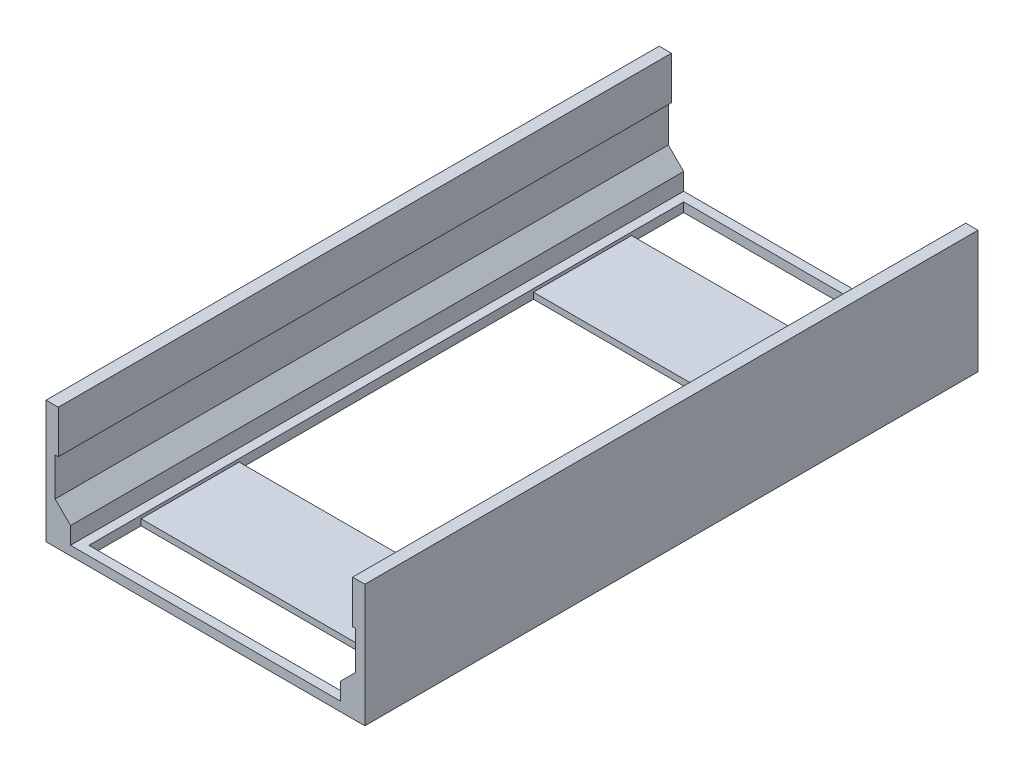
ISO-10303-21;
HEADER;
FILE_DESCRIPTION(('STEP AP214'),'2;1');
FILE_NAME('part.step','',(''),(''),'','','');
FILE_SCHEMA(('AUTOMOTIVE_DESIGN { 1 0 10303 214 1 1 1 1 }'));
ENDSEC;
DATA;
#1=APPLICATION_CONTEXT('core data for automotive mechanical design processes');
#2=APPLICATION_PROTOCOL_DEFINITION('international standard','automotive_design',2000,#1);
#3=PRODUCT_CONTEXT('',#1,'mechanical');
#4=PRODUCT('Part','Part','',(#3));
#5=PRODUCT_RELATED_PRODUCT_CATEGORY('part','',(#4));
#6=PRODUCT_DEFINITION_FORMATION('','',#4);
#7=PRODUCT_DEFINITION_CONTEXT('part definition',#1,'design');
#8=PRODUCT_DEFINITION('design','',#6,#7);
#9=PRODUCT_DEFINITION_SHAPE('','',#8);
#10=(LENGTH_UNIT() NAMED_UNIT(*) SI_UNIT(.MILLI.,.METRE.));
#11=(NAMED_UNIT(*) PLANE_ANGLE_UNIT() SI_UNIT($,.RADIAN.));
#12=(NAMED_UNIT(*) SI_UNIT($,.STERADIAN.) SOLID_ANGLE_UNIT());
#13=UNCERTAINTY_MEASURE_WITH_UNIT(LENGTH_MEASURE(1.E-05),#10,'distance_accuracy_value','');
#14=(GEOMETRIC_REPRESENTATION_CONTEXT(3) GLOBAL_UNCERTAINTY_ASSIGNED_CONTEXT((#13)) GLOBAL_UNIT_ASSIGNED_CONTEXT((#10,
#11,#12)) REPRESENTATION_CONTEXT('',''));
#15=CARTESIAN_POINT('',(0.,0.,0.));
#16=DIRECTION('',(0.,0.,1.));
#17=DIRECTION('',(1.,0.,0.));
#18=AXIS2_PLACEMENT_3D('',#15,#16,#17);
#19=CARTESIAN_POINT('',(-22.,-11.7071067811865,100.00005));
#20=DIRECTION('',(0.707106781186548,0.707106781186548,0.));
#21=DIRECTION('',(-0.707106781186548,0.707106781186548,0.));
#22=AXIS2_PLACEMENT_3D('',#19,#20,#21);
#23=PLANE('',#22);
#24=DIRECTION('',(0.707106781186547,-0.707106781186547,0.));
#25=VECTOR('',#24,1.);
#26=CARTESIAN_POINT('',(-22.,-11.7071067811865,0.));
#27=LINE('',#26,#25);
#28=CARTESIAN_POINT('',(-24.5,-9.20710678118655,0.));
#29=VERTEX_POINT('',#28);
#30=CARTESIAN_POINT('',(-22.,-11.7071067811865,0.));
#31=VERTEX_POINT('',#30);
#32=EDGE_CURVE('E307',#29,#31,#27,.T.);
#33=ORIENTED_EDGE('',*,*,#32,.F.);
#34=DIRECTION('',(0.,0.,-1.));
#35=VECTOR('',#34,1.);
#36=CARTESIAN_POINT('',(-24.5,-9.20710678118655,100.00005));
#37=LINE('',#36,#35);
#38=CARTESIAN_POINT('',(-24.5,-9.20710678118655,100.00005));
#39=VERTEX_POINT('',#38);
#40=EDGE_CURVE('E12',#39,#29,#37,.T.);
#41=ORIENTED_EDGE('',*,*,#40,.F.);
#42=DIRECTION('',(0.707106781186547,-0.707106781186547,0.));
#43=VECTOR('',#42,1.);
#44=CARTESIAN_POINT('',(-22.,-11.7071067811865,100.00005));
#45=LINE('',#44,#43);
#46=CARTESIAN_POINT('',(-22.,-11.7071067811865,100.00005));
#47=VERTEX_POINT('',#46);
#48=EDGE_CURVE('E314',#39,#47,#45,.T.);
#49=ORIENTED_EDGE('',*,*,#48,.T.);
#50=DIRECTION('',(0.,0.,-1.));
#51=VECTOR('',#50,1.);
#52=CARTESIAN_POINT('',(-22.,-11.7071067811865,100.00005));
#53=LINE('',#52,#51);
#54=EDGE_CURVE('E40',#47,#31,#53,.T.);
#55=ORIENTED_EDGE('',*,*,#54,.T.);
#56=EDGE_LOOP('',(#33,#41,#49,#55));
#57=FACE_BOUND('',#56,.T.);
#58=ADVANCED_FACE('F37',(#57),#23,.T.);
#59=CARTESIAN_POINT('',(-24.5,-9.20710678118655,100.00005));
#60=DIRECTION('',(1.,0.,0.));
#61=DIRECTION('',(0.,0.,-1.));
#62=AXIS2_PLACEMENT_3D('',#59,#60,#61);
#63=PLANE('',#62);
#64=DIRECTION('',(0.,-1.,0.));
#65=VECTOR('',#64,1.);
#66=CARTESIAN_POINT('',(-24.5,-9.20710678118655,0.));
#67=LINE('',#66,#65);
#68=CARTESIAN_POINT('',(-24.5,-3.,0.));
#69=VERTEX_POINT('',#68);
#70=EDGE_CURVE('E318',#69,#29,#67,.T.);
#71=ORIENTED_EDGE('',*,*,#70,.F.);
#72=DIRECTION('',(0.,0.,-1.));
#73=VECTOR('',#72,1.);
#74=CARTESIAN_POINT('',(-24.5,-3.,100.00005));
#75=LINE('',#74,#73);
#76=CARTESIAN_POINT('',(-24.5,-3.,100.00005));
#77=VERTEX_POINT('',#76);
#78=EDGE_CURVE('E45',#77,#69,#75,.T.);
#79=ORIENTED_EDGE('',*,*,#78,.F.);
#80=DIRECTION('',(0.,-1.,0.));
#81=VECTOR('',#80,1.);
#82=CARTESIAN_POINT('',(-24.5,-9.20710678118655,100.00005));
#83=LINE('',#82,#81);
#84=EDGE_CURVE('E358',#77,#39,#83,.T.);
#85=ORIENTED_EDGE('',*,*,#84,.T.);
#86=ORIENTED_EDGE('',*,*,#40,.T.);
#87=EDGE_LOOP('',(#71,#79,#85,#86));
#88=FACE_BOUND('',#87,.T.);
#89=ADVANCED_FACE('F447',(#88),#63,.T.);
#90=CARTESIAN_POINT('',(-24.5,-3.,100.00005));
#91=DIRECTION('',(0.,-1.,0.));
#92=DIRECTION('',(0.,0.,-1.));
#93=AXIS2_PLACEMENT_3D('',#90,#91,#92);
#94=PLANE('',#93);
#95=DIRECTION('',(-1.,0.,0.));
#96=VECTOR('',#95,1.);
#97=CARTESIAN_POINT('',(-24.5,-3.,0.));
#98=LINE('',#97,#96);
#99=CARTESIAN_POINT('',(-24.,-3.,0.));
#100=VERTEX_POINT('',#99);
#101=EDGE_CURVE('E402',#100,#69,#98,.T.);
#102=ORIENTED_EDGE('',*,*,#101,.F.);
#103=DIRECTION('',(0.,0.,-1.));
#104=VECTOR('',#103,1.);
#105=CARTESIAN_POINT('',(-24.,-3.,100.00005));
#106=LINE('',#105,#104);
#107=CARTESIAN_POINT('',(-24.,-3.,100.00005));
#108=VERTEX_POINT('',#107);
#109=EDGE_CURVE('E408',#108,#100,#106,.T.);
#110=ORIENTED_EDGE('',*,*,#109,.F.);
#111=DIRECTION('',(-1.,0.,0.));
#112=VECTOR('',#111,1.);
#113=CARTESIAN_POINT('',(-24.5,-3.,100.00005));
#114=LINE('',#113,#112);
#115=EDGE_CURVE('E355',#108,#77,#114,.T.);
#116=ORIENTED_EDGE('',*,*,#115,.T.);
#117=ORIENTED_EDGE('',*,*,#78,.T.);
#118=EDGE_LOOP('',(#102,#110,#116,#117));
#119=FACE_BOUND('',#118,.T.);
#120=ADVANCED_FACE('F500',(#119),#94,.T.);
#121=CARTESIAN_POINT('',(-24.,-3.,100.00005));
#122=DIRECTION('',(1.,0.,0.));
#123=DIRECTION('',(0.,0.,-1.));
#124=AXIS2_PLACEMENT_3D('',#121,#122,#123);
#125=PLANE('',#124);
#126=DIRECTION('',(0.,-1.,0.));
#127=VECTOR('',#126,1.);
#128=CARTESIAN_POINT('',(-24.,-3.,0.));
#129=LINE('',#128,#127);
#130=CARTESIAN_POINT('',(-24.,4.,0.));
#131=VERTEX_POINT('',#130);
#132=EDGE_CURVE('E399',#131,#100,#129,.T.);
#133=ORIENTED_EDGE('',*,*,#132,.F.);
#134=DIRECTION('',(0.,0.,-1.));
#135=VECTOR('',#134,1.);
#136=CARTESIAN_POINT('',(-24.,4.,100.00005));
#137=LINE('',#136,#135);
#138=CARTESIAN_POINT('',(-24.,4.,100.00005));
#139=VERTEX_POINT('',#138);
#140=EDGE_CURVE('E410',#139,#131,#137,.T.);
#141=ORIENTED_EDGE('',*,*,#140,.F.);
#142=DIRECTION('',(0.,-1.,0.));
#143=VECTOR('',#142,1.);
#144=CARTESIAN_POINT('',(-24.,-3.,100.00005));
#145=LINE('',#144,#143);
#146=EDGE_CURVE('E352',#139,#108,#145,.T.);
#147=ORIENTED_EDGE('',*,*,#146,.T.);
#148=ORIENTED_EDGE('',*,*,#109,.T.);
#149=EDGE_LOOP('',(#133,#141,#147,#148));
#150=FACE_BOUND('',#149,.T.);
#151=ADVANCED_FACE('F498',(#150),#125,.T.);
#152=CARTESIAN_POINT('',(-24.,4.,100.00005));
#153=DIRECTION('',(0.,1.,0.));
#154=DIRECTION('',(0.,0.,1.));
#155=AXIS2_PLACEMENT_3D('',#152,#153,#154);
#156=PLANE('',#155);
#157=DIRECTION('',(1.,0.,0.));
#158=VECTOR('',#157,1.);
#159=CARTESIAN_POINT('',(-24.,4.,0.));
#160=LINE('',#159,#158);
#161=CARTESIAN_POINT('',(-26.,4.,0.));
#162=VERTEX_POINT('',#161);
#163=EDGE_CURVE('E396',#162,#131,#160,.T.);
#164=ORIENTED_EDGE('',*,*,#163,.F.);
#165=DIRECTION('',(0.,0.,-1.));
#166=VECTOR('',#165,1.);
#167=CARTESIAN_POINT('',(-26.,4.,100.00005));
#168=LINE('',#167,#166);
#169=CARTESIAN_POINT('',(-26.,4.,100.00005));
#170=VERTEX_POINT('',#169);
#171=EDGE_CURVE('E412',#170,#162,#168,.T.);
#172=ORIENTED_EDGE('',*,*,#171,.F.);
#173=DIRECTION('',(1.,0.,0.));
#174=VECTOR('',#173,1.);
#175=CARTESIAN_POINT('',(-24.,4.,100.00005));
#176=LINE('',#175,#174);
#177=EDGE_CURVE('E349',#170,#139,#176,.T.);
#178=ORIENTED_EDGE('',*,*,#177,.T.);
#179=ORIENTED_EDGE('',*,*,#140,.T.);
#180=EDGE_LOOP('',(#164,#172,#178,#179));
#181=FACE_BOUND('',#180,.T.);
#182=ADVANCED_FACE('F495',(#181),#156,.T.);
#183=CARTESIAN_POINT('',(-26.,4.,100.00005));
#184=DIRECTION('',(-1.,0.,0.));
#185=DIRECTION('',(0.,0.,1.));
#186=AXIS2_PLACEMENT_3D('',#183,#184,#185);
#187=PLANE('',#186);
#188=DIRECTION('',(0.,1.,0.));
#189=VECTOR('',#188,1.);
#190=CARTESIAN_POINT('',(-26.,4.,0.));
#191=LINE('',#190,#189);
#192=CARTESIAN_POINT('',(-26.,-16.,0.));
#193=VERTEX_POINT('',#192);
#194=EDGE_CURVE('E393',#193,#162,#191,.T.);
#195=ORIENTED_EDGE('',*,*,#194,.F.);
#196=DIRECTION('',(0.,0.,-1.));
#197=VECTOR('',#196,1.);
#198=CARTESIAN_POINT('',(-26.,-16.,100.00005));
#199=LINE('',#198,#197);
#200=CARTESIAN_POINT('',(-26.,-16.,100.00005));
#201=VERTEX_POINT('',#200);
#202=EDGE_CURVE('E414',#201,#193,#199,.T.);
#203=ORIENTED_EDGE('',*,*,#202,.F.);
#204=DIRECTION('',(0.,1.,0.));
#205=VECTOR('',#204,1.);
#206=CARTESIAN_POINT('',(-26.,-14.5,100.00005));
#207=LINE('',#206,#205);
#208=EDGE_CURVE('E347',#201,#170,#207,.T.);
#209=ORIENTED_EDGE('',*,*,#208,.T.);
#210=ORIENTED_EDGE('',*,*,#171,.T.);
#211=EDGE_LOOP('',(#195,#203,#209,#210));
#212=FACE_BOUND('',#211,.T.);
#213=ADVANCED_FACE('F489',(#212),#187,.T.);
#214=CARTESIAN_POINT('',(-26.,-16.,100.00005));
#215=DIRECTION('',(0.,-1.,0.));
#216=DIRECTION('',(0.,0.,-1.));
#217=AXIS2_PLACEMENT_3D('',#214,#215,#216);
#218=PLANE('',#217);
#219=DIRECTION('',(0.,0.,-1.));
#220=VECTOR('',#219,1.);
#221=CARTESIAN_POINT('',(20.5,-16.,98.50005));
#222=LINE('',#221,#220);
#223=CARTESIAN_POINT('',(20.5,-16.,74.00005));
#224=VERTEX_POINT('',#223);
#225=CARTESIAN_POINT('',(20.5,-16.,26.));
#226=VERTEX_POINT('',#225);
#227=EDGE_CURVE('E284',#224,#226,#222,.T.);
#228=ORIENTED_EDGE('',*,*,#227,.T.);
#229=DIRECTION('',(-1.,0.,0.));
#230=VECTOR('',#229,1.);
#231=CARTESIAN_POINT('',(20.5,-16.,26.));
#232=LINE('',#231,#230);
#233=CARTESIAN_POINT('',(-20.5,-16.,26.));
#234=VERTEX_POINT('',#233);
#235=EDGE_CURVE('E61',#226,#234,#232,.T.);
#236=ORIENTED_EDGE('',*,*,#235,.T.);
#237=DIRECTION('',(0.,0.,1.));
#238=VECTOR('',#237,1.);
#239=CARTESIAN_POINT('',(-20.5,-16.,1.5));
#240=LINE('',#239,#238);
#241=CARTESIAN_POINT('',(-20.5,-16.,74.00005));
#242=VERTEX_POINT('',#241);
#243=EDGE_CURVE('E243',#234,#242,#240,.T.);
#244=ORIENTED_EDGE('',*,*,#243,.T.);
#245=DIRECTION('',(1.,0.,0.));
#246=VECTOR('',#245,1.);
#247=CARTESIAN_POINT('',(20.5,-16.,74.00005));
#248=LINE('',#247,#246);
#249=EDGE_CURVE('E266',#242,#224,#248,.T.);
#250=ORIENTED_EDGE('',*,*,#249,.T.);
#251=EDGE_LOOP('',(#228,#236,#244,#250));
#252=FACE_BOUND('',#251,.T.);
#253=CARTESIAN_POINT('',(20.5,-16.,98.50005));
#254=VERTEX_POINT('',#253);
#255=CARTESIAN_POINT('',(20.5,-16.,90.00005));
#256=VERTEX_POINT('',#255);
#257=EDGE_CURVE('E280',#254,#256,#222,.T.);
#258=ORIENTED_EDGE('',*,*,#257,.T.);
#259=DIRECTION('',(-1.,0.,0.));
#260=VECTOR('',#259,1.);
#261=CARTESIAN_POINT('',(-20.5,-16.,90.00005));
#262=LINE('',#261,#260);
#263=CARTESIAN_POINT('',(-20.5,-16.,90.00005));
#264=VERTEX_POINT('',#263);
#265=EDGE_CURVE('E256',#256,#264,#262,.T.);
#266=ORIENTED_EDGE('',*,*,#265,.T.);
#267=CARTESIAN_POINT('',(-20.5,-16.,98.50005));
#268=VERTEX_POINT('',#267);
#269=EDGE_CURVE('E288',#264,#268,#240,.T.);
#270=ORIENTED_EDGE('',*,*,#269,.T.);
#271=DIRECTION('',(1.,0.,0.));
#272=VECTOR('',#271,1.);
#273=CARTESIAN_POINT('',(-20.5,-16.,98.50005));
#274=LINE('',#273,#272);
#275=EDGE_CURVE('E291',#268,#254,#274,.T.);
#276=ORIENTED_EDGE('',*,*,#275,.T.);
#277=EDGE_LOOP('',(#258,#266,#270,#276));
#278=FACE_BOUND('',#277,.T.);
#279=DIRECTION('',(1.,0.,0.));
#280=VECTOR('',#279,1.);
#281=CARTESIAN_POINT('',(-20.5,-16.,10.));
#282=LINE('',#281,#280);
#283=CARTESIAN_POINT('',(-20.5,-16.,10.));
#284=VERTEX_POINT('',#283);
#285=CARTESIAN_POINT('',(20.5,-16.,10.));
#286=VERTEX_POINT('',#285);
#287=EDGE_CURVE('E53',#284,#286,#282,.T.);
#288=ORIENTED_EDGE('',*,*,#287,.T.);
#289=CARTESIAN_POINT('',(20.5,-16.,1.5));
#290=VERTEX_POINT('',#289);
#291=EDGE_CURVE('E285',#286,#290,#222,.T.);
#292=ORIENTED_EDGE('',*,*,#291,.T.);
#293=DIRECTION('',(-1.,0.,0.));
#294=VECTOR('',#293,1.);
#295=CARTESIAN_POINT('',(20.5,-16.,1.5));
#296=LINE('',#295,#294);
#297=CARTESIAN_POINT('',(-20.5,-16.,1.5));
#298=VERTEX_POINT('',#297);
#299=EDGE_CURVE('E283',#290,#298,#296,.T.);
#300=ORIENTED_EDGE('',*,*,#299,.T.);
#301=EDGE_CURVE('E289',#298,#284,#240,.T.);
#302=ORIENTED_EDGE('',*,*,#301,.T.);
#303=EDGE_LOOP('',(#288,#292,#300,#302));
#304=FACE_BOUND('',#303,.T.);
#305=DIRECTION('',(-1.,0.,0.));
#306=VECTOR('',#305,1.);
#307=CARTESIAN_POINT('',(-26.,-16.,0.));
#308=LINE('',#307,#306);
#309=CARTESIAN_POINT('',(26.,-16.,0.));
#310=VERTEX_POINT('',#309);
#311=EDGE_CURVE('E390',#310,#193,#308,.T.);
#312=ORIENTED_EDGE('',*,*,#311,.F.);
#313=DIRECTION('',(0.,0.,-1.));
#314=VECTOR('',#313,1.);
#315=CARTESIAN_POINT('',(26.,-16.,100.00005));
#316=LINE('',#315,#314);
#317=CARTESIAN_POINT('',(26.,-16.,100.00005));
#318=VERTEX_POINT('',#317);
#319=EDGE_CURVE('E417',#318,#310,#316,.T.);
#320=ORIENTED_EDGE('',*,*,#319,.F.);
#321=DIRECTION('',(-1.,0.,0.));
#322=VECTOR('',#321,1.);
#323=CARTESIAN_POINT('',(-26.,-16.,100.00005));
#324=LINE('',#323,#322);
#325=EDGE_CURVE('E344',#318,#201,#324,.T.);
#326=ORIENTED_EDGE('',*,*,#325,.T.);
#327=ORIENTED_EDGE('',*,*,#202,.T.);
#328=EDGE_LOOP('',(#312,#320,#326,#327));
#329=FACE_BOUND('',#328,.T.);
#330=ADVANCED_FACE('F486',(#252,#278,#304,#329),#218,.T.);
#331=CARTESIAN_POINT('',(26.,-14.5,100.00005));
#332=DIRECTION('',(1.,0.,0.));
#333=DIRECTION('',(0.,0.,-1.));
#334=AXIS2_PLACEMENT_3D('',#331,#332,#333);
#335=PLANE('',#334);
#336=DIRECTION('',(0.,-1.,0.));
#337=VECTOR('',#336,1.);
#338=CARTESIAN_POINT('',(26.,-14.5,0.));
#339=LINE('',#338,#337);
#340=CARTESIAN_POINT('',(26.,4.,0.));
#341=VERTEX_POINT('',#340);
#342=EDGE_CURVE('E387',#341,#310,#339,.T.);
#343=ORIENTED_EDGE('',*,*,#342,.F.);
#344=DIRECTION('',(0.,0.,-1.));
#345=VECTOR('',#344,1.);
#346=CARTESIAN_POINT('',(26.,4.,100.00005));
#347=LINE('',#346,#345);
#348=CARTESIAN_POINT('',(26.,4.,100.00005));
#349=VERTEX_POINT('',#348);
#350=EDGE_CURVE('E419',#349,#341,#347,.T.);
#351=ORIENTED_EDGE('',*,*,#350,.F.);
#352=DIRECTION('',(0.,-1.,0.));
#353=VECTOR('',#352,1.);
#354=CARTESIAN_POINT('',(26.,4.,100.00005));
#355=LINE('',#354,#353);
#356=EDGE_CURVE('E342',#349,#318,#355,.T.);
#357=ORIENTED_EDGE('',*,*,#356,.T.);
#358=ORIENTED_EDGE('',*,*,#319,.T.);
#359=EDGE_LOOP('',(#343,#351,#357,#358));
#360=FACE_BOUND('',#359,.T.);
#361=ADVANCED_FACE('F481',(#360),#335,.T.);
#362=CARTESIAN_POINT('',(24.,4.,100.00005));
#363=DIRECTION('',(0.,1.,0.));
#364=DIRECTION('',(0.,0.,1.));
#365=AXIS2_PLACEMENT_3D('',#362,#363,#364);
#366=PLANE('',#365);
#367=DIRECTION('',(1.,0.,0.));
#368=VECTOR('',#367,1.);
#369=CARTESIAN_POINT('',(24.,4.,0.));
#370=LINE('',#369,#368);
#371=CARTESIAN_POINT('',(24.,4.,0.));
#372=VERTEX_POINT('',#371);
#373=EDGE_CURVE('E384',#372,#341,#370,.T.);
#374=ORIENTED_EDGE('',*,*,#373,.F.);
#375=DIRECTION('',(0.,0.,-1.));
#376=VECTOR('',#375,1.);
#377=CARTESIAN_POINT('',(24.,4.,100.00005));
#378=LINE('',#377,#376);
#379=CARTESIAN_POINT('',(24.,4.,100.00005));
#380=VERTEX_POINT('',#379);
#381=EDGE_CURVE('E422',#380,#372,#378,.T.);
#382=ORIENTED_EDGE('',*,*,#381,.F.);
#383=DIRECTION('',(1.,0.,0.));
#384=VECTOR('',#383,1.);
#385=CARTESIAN_POINT('',(24.,4.,100.00005));
#386=LINE('',#385,#384);
#387=EDGE_CURVE('E339',#380,#349,#386,.T.);
#388=ORIENTED_EDGE('',*,*,#387,.T.);
#389=ORIENTED_EDGE('',*,*,#350,.T.);
#390=EDGE_LOOP('',(#374,#382,#388,#389));
#391=FACE_BOUND('',#390,.T.);
#392=ADVANCED_FACE('F478',(#391),#366,.T.);
#393=CARTESIAN_POINT('',(24.,4.,100.00005));
#394=DIRECTION('',(-1.,0.,0.));
#395=DIRECTION('',(0.,0.,1.));
#396=AXIS2_PLACEMENT_3D('',#393,#394,#395);
#397=PLANE('',#396);
#398=DIRECTION('',(0.,1.,0.));
#399=VECTOR('',#398,1.);
#400=CARTESIAN_POINT('',(24.,4.,0.));
#401=LINE('',#400,#399);
#402=CARTESIAN_POINT('',(24.,-3.,0.));
#403=VERTEX_POINT('',#402);
#404=EDGE_CURVE('E381',#403,#372,#401,.T.);
#405=ORIENTED_EDGE('',*,*,#404,.F.);
#406=DIRECTION('',(0.,0.,-1.));
#407=VECTOR('',#406,1.);
#408=CARTESIAN_POINT('',(24.,-3.,100.00005));
#409=LINE('',#408,#407);
#410=CARTESIAN_POINT('',(24.,-3.,100.00005));
#411=VERTEX_POINT('',#410);
#412=EDGE_CURVE('E424',#411,#403,#409,.T.);
#413=ORIENTED_EDGE('',*,*,#412,.F.);
#414=DIRECTION('',(0.,1.,0.));
#415=VECTOR('',#414,1.);
#416=CARTESIAN_POINT('',(24.,4.,100.00005));
#417=LINE('',#416,#415);
#418=EDGE_CURVE('E336',#411,#380,#417,.T.);
#419=ORIENTED_EDGE('',*,*,#418,.T.);
#420=ORIENTED_EDGE('',*,*,#381,.T.);
#421=EDGE_LOOP('',(#405,#413,#419,#420));
#422=FACE_BOUND('',#421,.T.);
#423=ADVANCED_FACE('F474',(#422),#397,.T.);
#424=CARTESIAN_POINT('',(24.,-3.,100.00005));
#425=DIRECTION('',(0.,-1.,0.));
#426=DIRECTION('',(0.,0.,-1.));
#427=AXIS2_PLACEMENT_3D('',#424,#425,#426);
#428=PLANE('',#427);
#429=DIRECTION('',(-1.,0.,0.));
#430=VECTOR('',#429,1.);
#431=CARTESIAN_POINT('',(24.,-3.,0.));
#432=LINE('',#431,#430);
#433=CARTESIAN_POINT('',(24.5,-3.,0.));
#434=VERTEX_POINT('',#433);
#435=EDGE_CURVE('E378',#434,#403,#432,.T.);
#436=ORIENTED_EDGE('',*,*,#435,.F.);
#437=DIRECTION('',(0.,0.,-1.));
#438=VECTOR('',#437,1.);
#439=CARTESIAN_POINT('',(24.5,-3.,100.00005));
#440=LINE('',#439,#438);
#441=CARTESIAN_POINT('',(24.5,-3.,100.00005));
#442=VERTEX_POINT('',#441);
#443=EDGE_CURVE('E426',#442,#434,#440,.T.);
#444=ORIENTED_EDGE('',*,*,#443,.F.);
#445=DIRECTION('',(-1.,0.,0.));
#446=VECTOR('',#445,1.);
#447=CARTESIAN_POINT('',(24.,-3.,100.00005));
#448=LINE('',#447,#446);
#449=EDGE_CURVE('E333',#442,#411,#448,.T.);
#450=ORIENTED_EDGE('',*,*,#449,.T.);
#451=ORIENTED_EDGE('',*,*,#412,.T.);
#452=EDGE_LOOP('',(#436,#444,#450,#451));
#453=FACE_BOUND('',#452,.T.);
#454=ADVANCED_FACE('F470',(#453),#428,.T.);
#455=CARTESIAN_POINT('',(24.5,-3.,100.00005));
#456=DIRECTION('',(-1.,0.,0.));
#457=DIRECTION('',(0.,0.,1.));
#458=AXIS2_PLACEMENT_3D('',#455,#456,#457);
#459=PLANE('',#458);
#460=DIRECTION('',(0.,1.,0.));
#461=VECTOR('',#460,1.);
#462=CARTESIAN_POINT('',(24.5,-3.,0.));
#463=LINE('',#462,#461);
#464=CARTESIAN_POINT('',(24.5,-9.20710678118654,0.));
#465=VERTEX_POINT('',#464);
#466=EDGE_CURVE('E375',#465,#434,#463,.T.);
#467=ORIENTED_EDGE('',*,*,#466,.F.);
#468=DIRECTION('',(0.,0.,-1.));
#469=VECTOR('',#468,1.);
#470=CARTESIAN_POINT('',(24.5,-9.20710678118654,100.00005));
#471=LINE('',#470,#469);
#472=CARTESIAN_POINT('',(24.5,-9.20710678118654,100.00005));
#473=VERTEX_POINT('',#472);
#474=EDGE_CURVE('E428',#473,#465,#471,.T.);
#475=ORIENTED_EDGE('',*,*,#474,.F.);
#476=DIRECTION('',(0.,1.,0.));
#477=VECTOR('',#476,1.);
#478=CARTESIAN_POINT('',(24.5,-3.,100.00005));
#479=LINE('',#478,#477);
#480=EDGE_CURVE('E330',#473,#442,#479,.T.);
#481=ORIENTED_EDGE('',*,*,#480,.T.);
#482=ORIENTED_EDGE('',*,*,#443,.T.);
#483=EDGE_LOOP('',(#467,#475,#481,#482));
#484=FACE_BOUND('',#483,.T.);
#485=ADVANCED_FACE('F466',(#484),#459,.T.);
#486=CARTESIAN_POINT('',(24.5,-9.20710678118654,100.00005));
#487=DIRECTION('',(-0.707106781186548,0.707106781186548,0.));
#488=DIRECTION('',(-0.707106781186548,-0.707106781186548,0.));
#489=AXIS2_PLACEMENT_3D('',#486,#487,#488);
#490=PLANE('',#489);
#491=DIRECTION('',(0.707106781186547,0.707106781186547,0.));
#492=VECTOR('',#491,1.);
#493=CARTESIAN_POINT('',(24.5,-9.20710678118654,0.));
#494=LINE('',#493,#492);
#495=CARTESIAN_POINT('',(22.,-11.7071067811865,0.));
#496=VERTEX_POINT('',#495);
#497=EDGE_CURVE('E372',#496,#465,#494,.T.);
#498=ORIENTED_EDGE('',*,*,#497,.F.);
#499=DIRECTION('',(0.,0.,-1.));
#500=VECTOR('',#499,1.);
#501=CARTESIAN_POINT('',(22.,-11.7071067811865,100.00005));
#502=LINE('',#501,#500);
#503=CARTESIAN_POINT('',(22.,-11.7071067811865,100.00005));
#504=VERTEX_POINT('',#503);
#505=EDGE_CURVE('E430',#504,#496,#502,.T.);
#506=ORIENTED_EDGE('',*,*,#505,.F.);
#507=DIRECTION('',(0.707106781186547,0.707106781186547,0.));
#508=VECTOR('',#507,1.);
#509=CARTESIAN_POINT('',(24.5,-9.20710678118654,100.00005));
#510=LINE('',#509,#508);
#511=EDGE_CURVE('E327',#504,#473,#510,.T.);
#512=ORIENTED_EDGE('',*,*,#511,.T.);
#513=ORIENTED_EDGE('',*,*,#474,.T.);
#514=EDGE_LOOP('',(#498,#506,#512,#513));
#515=FACE_BOUND('',#514,.T.);
#516=ADVANCED_FACE('F462',(#515),#490,.T.);
#517=CARTESIAN_POINT('',(22.,-11.7071067811865,100.00005));
#518=DIRECTION('',(-1.,0.,0.));
#519=DIRECTION('',(0.,0.,1.));
#520=AXIS2_PLACEMENT_3D('',#517,#518,#519);
#521=PLANE('',#520);
#522=DIRECTION('',(0.,1.,0.));
#523=VECTOR('',#522,1.);
#524=CARTESIAN_POINT('',(22.,-11.7071067811865,0.));
#525=LINE('',#524,#523);
#526=CARTESIAN_POINT('',(22.,-14.5,0.));
#527=VERTEX_POINT('',#526);
#528=EDGE_CURVE('E369',#527,#496,#525,.T.);
#529=ORIENTED_EDGE('',*,*,#528,.F.);
#530=DIRECTION('',(0.,0.,-1.));
#531=VECTOR('',#530,1.);
#532=CARTESIAN_POINT('',(22.,-14.5,100.00005));
#533=LINE('',#532,#531);
#534=CARTESIAN_POINT('',(22.,-14.5,100.00005));
#535=VERTEX_POINT('',#534);
#536=EDGE_CURVE('E432',#535,#527,#533,.T.);
#537=ORIENTED_EDGE('',*,*,#536,.F.);
#538=DIRECTION('',(0.,1.,0.));
#539=VECTOR('',#538,1.);
#540=CARTESIAN_POINT('',(22.,-11.7071067811865,100.00005));
#541=LINE('',#540,#539);
#542=EDGE_CURVE('E324',#535,#504,#541,.T.);
#543=ORIENTED_EDGE('',*,*,#542,.T.);
#544=ORIENTED_EDGE('',*,*,#505,.T.);
#545=EDGE_LOOP('',(#529,#537,#543,#544));
#546=FACE_BOUND('',#545,.T.);
#547=ADVANCED_FACE('F460',(#546),#521,.T.);
#548=CARTESIAN_POINT('',(22.,-14.5,100.00005));
#549=DIRECTION('',(0.,1.,0.));
#550=DIRECTION('',(0.,0.,1.));
#551=AXIS2_PLACEMENT_3D('',#548,#549,#550);
#552=PLANE('',#551);
#553=DIRECTION('',(0.,0.,-1.));
#554=VECTOR('',#553,1.);
#555=CARTESIAN_POINT('',(20.5,-14.5,98.50005));
#556=LINE('',#555,#554);
#557=CARTESIAN_POINT('',(20.5,-14.5,98.50005));
#558=VERTEX_POINT('',#557);
#559=CARTESIAN_POINT('',(20.5,-14.5,1.5));
#560=VERTEX_POINT('',#559);
#561=EDGE_CURVE('E272',#558,#560,#556,.T.);
#562=ORIENTED_EDGE('',*,*,#561,.F.);
#563=DIRECTION('',(1.,0.,0.));
#564=VECTOR('',#563,1.);
#565=CARTESIAN_POINT('',(-20.5,-14.5,98.50005));
#566=LINE('',#565,#564);
#567=CARTESIAN_POINT('',(-20.5,-14.5,98.50005));
#568=VERTEX_POINT('',#567);
#569=EDGE_CURVE('E302',#568,#558,#566,.T.);
#570=ORIENTED_EDGE('',*,*,#569,.F.);
#571=DIRECTION('',(0.,0.,1.));
#572=VECTOR('',#571,1.);
#573=CARTESIAN_POINT('',(-20.5,-14.5,1.5));
#574=LINE('',#573,#572);
#575=CARTESIAN_POINT('',(-20.5,-14.5,1.5));
#576=VERTEX_POINT('',#575);
#577=EDGE_CURVE('E299',#576,#568,#574,.T.);
#578=ORIENTED_EDGE('',*,*,#577,.F.);
#579=DIRECTION('',(-1.,0.,0.));
#580=VECTOR('',#579,1.);
#581=CARTESIAN_POINT('',(20.5,-14.5,1.5));
#582=LINE('',#581,#580);
#583=EDGE_CURVE('E296',#560,#576,#582,.T.);
#584=ORIENTED_EDGE('',*,*,#583,.F.);
#585=EDGE_LOOP('',(#562,#570,#578,#584));
#586=FACE_BOUND('',#585,.T.);
#587=DIRECTION('',(1.,0.,0.));
#588=VECTOR('',#587,1.);
#589=CARTESIAN_POINT('',(22.,-14.5,0.));
#590=LINE('',#589,#588);
#591=CARTESIAN_POINT('',(-22.,-14.5,0.));
#592=VERTEX_POINT('',#591);
#593=EDGE_CURVE('E366',#592,#527,#590,.T.);
#594=ORIENTED_EDGE('',*,*,#593,.F.);
#595=DIRECTION('',(0.,0.,-1.));
#596=VECTOR('',#595,1.);
#597=CARTESIAN_POINT('',(-22.,-14.5,100.00005));
#598=LINE('',#597,#596);
#599=CARTESIAN_POINT('',(-22.,-14.5,100.00005));
#600=VERTEX_POINT('',#599);
#601=EDGE_CURVE('E433',#600,#592,#598,.T.);
#602=ORIENTED_EDGE('',*,*,#601,.F.);
#603=DIRECTION('',(1.,0.,0.));
#604=VECTOR('',#603,1.);
#605=CARTESIAN_POINT('',(22.,-14.5,100.00005));
#606=LINE('',#605,#604);
#607=EDGE_CURVE('E321',#600,#535,#606,.T.);
#608=ORIENTED_EDGE('',*,*,#607,.T.);
#609=ORIENTED_EDGE('',*,*,#536,.T.);
#610=EDGE_LOOP('',(#594,#602,#608,#609));
#611=FACE_BOUND('',#610,.T.);
#612=ADVANCED_FACE('F456',(#586,#611),#552,.T.);
#613=CARTESIAN_POINT('',(-22.,-14.5,100.00005));
#614=DIRECTION('',(1.,0.,0.));
#615=DIRECTION('',(0.,0.,-1.));
#616=AXIS2_PLACEMENT_3D('',#613,#614,#615);
#617=PLANE('',#616);
#618=DIRECTION('',(0.,-1.,0.));
#619=VECTOR('',#618,1.);
#620=CARTESIAN_POINT('',(-22.,-14.5,0.));
#621=LINE('',#620,#619);
#622=EDGE_CURVE('E363',#31,#592,#621,.T.);
#623=ORIENTED_EDGE('',*,*,#622,.F.);
#624=ORIENTED_EDGE('',*,*,#54,.F.);
#625=DIRECTION('',(0.,-1.,0.));
#626=VECTOR('',#625,1.);
#627=CARTESIAN_POINT('',(-22.,-14.5,100.00005));
#628=LINE('',#627,#626);
#629=EDGE_CURVE('E317',#47,#600,#628,.T.);
#630=ORIENTED_EDGE('',*,*,#629,.T.);
#631=ORIENTED_EDGE('',*,*,#601,.T.);
#632=EDGE_LOOP('',(#623,#624,#630,#631));
#633=FACE_BOUND('',#632,.T.);
#634=ADVANCED_FACE('F441',(#633),#617,.T.);
#635=CARTESIAN_POINT('',(0.,0.,100.00005));
#636=DIRECTION('',(0.,0.,1.));
#637=DIRECTION('',(1.,0.,0.));
#638=AXIS2_PLACEMENT_3D('',#635,#636,#637);
#639=PLANE('',#638);
#640=ORIENTED_EDGE('',*,*,#48,.F.);
#641=ORIENTED_EDGE('',*,*,#84,.F.);
#642=ORIENTED_EDGE('',*,*,#115,.F.);
#643=ORIENTED_EDGE('',*,*,#146,.F.);
#644=ORIENTED_EDGE('',*,*,#177,.F.);
#645=ORIENTED_EDGE('',*,*,#208,.F.);
#646=ORIENTED_EDGE('',*,*,#325,.F.);
#647=ORIENTED_EDGE('',*,*,#356,.F.);
#648=ORIENTED_EDGE('',*,*,#387,.F.);
#649=ORIENTED_EDGE('',*,*,#418,.F.);
#650=ORIENTED_EDGE('',*,*,#449,.F.);
#651=ORIENTED_EDGE('',*,*,#480,.F.);
#652=ORIENTED_EDGE('',*,*,#511,.F.);
#653=ORIENTED_EDGE('',*,*,#542,.F.);
#654=ORIENTED_EDGE('',*,*,#607,.F.);
#655=ORIENTED_EDGE('',*,*,#629,.F.);
#656=EDGE_LOOP('',(#640,#641,#642,#643,#644,#645,#646,#647,#648,#649,#650,#651,#652,#653,#654,#655));
#657=FACE_BOUND('',#656,.T.);
#658=ADVANCED_FACE('F450',(#657),#639,.T.);
#659=CARTESIAN_POINT('',(0.,0.,0.));
#660=DIRECTION('',(0.,0.,1.));
#661=DIRECTION('',(1.,0.,0.));
#662=AXIS2_PLACEMENT_3D('',#659,#660,#661);
#663=PLANE('',#662);
#664=ORIENTED_EDGE('',*,*,#32,.T.);
#665=ORIENTED_EDGE('',*,*,#622,.T.);
#666=ORIENTED_EDGE('',*,*,#593,.T.);
#667=ORIENTED_EDGE('',*,*,#528,.T.);
#668=ORIENTED_EDGE('',*,*,#497,.T.);
#669=ORIENTED_EDGE('',*,*,#466,.T.);
#670=ORIENTED_EDGE('',*,*,#435,.T.);
#671=ORIENTED_EDGE('',*,*,#404,.T.);
#672=ORIENTED_EDGE('',*,*,#373,.T.);
#673=ORIENTED_EDGE('',*,*,#342,.T.);
#674=ORIENTED_EDGE('',*,*,#311,.T.);
#675=ORIENTED_EDGE('',*,*,#194,.T.);
#676=ORIENTED_EDGE('',*,*,#163,.T.);
#677=ORIENTED_EDGE('',*,*,#132,.T.);
#678=ORIENTED_EDGE('',*,*,#101,.T.);
#679=ORIENTED_EDGE('',*,*,#70,.T.);
#680=EDGE_LOOP('',(#664,#665,#666,#667,#668,#669,#670,#671,#672,#673,#674,#675,#676,#677,#678,#679));
#681=FACE_BOUND('',#680,.T.);
#682=ADVANCED_FACE('F443',(#681),#663,.F.);
#683=CARTESIAN_POINT('',(20.5,-16.,98.50005));
#684=DIRECTION('',(1.,0.,0.));
#685=DIRECTION('',(0.,0.,-1.));
#686=AXIS2_PLACEMENT_3D('',#683,#684,#685);
#687=PLANE('',#686);
#688=DIRECTION('',(0.,0.,1.));
#689=VECTOR('',#688,1.);
#690=CARTESIAN_POINT('',(20.5,-15.,10.));
#691=LINE('',#690,#689);
#692=CARTESIAN_POINT('',(20.5,-15.,10.));
#693=VERTEX_POINT('',#692);
#694=CARTESIAN_POINT('',(20.5,-15.,26.));
#695=VERTEX_POINT('',#694);
#696=EDGE_CURVE('E245',#693,#695,#691,.T.);
#697=ORIENTED_EDGE('',*,*,#696,.T.);
#698=DIRECTION('',(0.,-1.,0.));
#699=VECTOR('',#698,1.);
#700=CARTESIAN_POINT('',(20.5,-15.,26.));
#701=LINE('',#700,#699);
#702=EDGE_CURVE('E239',#695,#226,#701,.T.);
#703=ORIENTED_EDGE('',*,*,#702,.T.);
#704=ORIENTED_EDGE('',*,*,#227,.F.);
#705=DIRECTION('',(0.,-1.,0.));
#706=VECTOR('',#705,1.);
#707=CARTESIAN_POINT('',(20.5,-15.,74.00005));
#708=LINE('',#707,#706);
#709=CARTESIAN_POINT('',(20.5,-15.,74.00005));
#710=VERTEX_POINT('',#709);
#711=EDGE_CURVE('E276',#710,#224,#708,.T.);
#712=ORIENTED_EDGE('',*,*,#711,.F.);
#713=DIRECTION('',(0.,0.,1.));
#714=VECTOR('',#713,1.);
#715=CARTESIAN_POINT('',(20.5,-15.,90.00005));
#716=LINE('',#715,#714);
#717=CARTESIAN_POINT('',(20.5,-15.,90.00005));
#718=VERTEX_POINT('',#717);
#719=EDGE_CURVE('E259',#710,#718,#716,.T.);
#720=ORIENTED_EDGE('',*,*,#719,.T.);
#721=DIRECTION('',(0.,-1.,0.));
#722=VECTOR('',#721,1.);
#723=CARTESIAN_POINT('',(20.5,-15.,90.00005));
#724=LINE('',#723,#722);
#725=EDGE_CURVE('E273',#718,#256,#724,.T.);
#726=ORIENTED_EDGE('',*,*,#725,.T.);
#727=ORIENTED_EDGE('',*,*,#257,.F.);
#728=DIRECTION('',(0.,1.,0.));
#729=VECTOR('',#728,1.);
#730=CARTESIAN_POINT('',(20.5,-16.,98.50005));
#731=LINE('',#730,#729);
#732=EDGE_CURVE('E305',#254,#558,#731,.T.);
#733=ORIENTED_EDGE('',*,*,#732,.T.);
#734=ORIENTED_EDGE('',*,*,#561,.T.);
#735=DIRECTION('',(0.,1.,0.));
#736=VECTOR('',#735,1.);
#737=CARTESIAN_POINT('',(20.5,-16.,1.5));
#738=LINE('',#737,#736);
#739=EDGE_CURVE('E294',#290,#560,#738,.T.);
#740=ORIENTED_EDGE('',*,*,#739,.F.);
#741=ORIENTED_EDGE('',*,*,#291,.F.);
#742=DIRECTION('',(0.,-1.,0.));
#743=VECTOR('',#742,1.);
#744=CARTESIAN_POINT('',(20.5,-15.,10.));
#745=LINE('',#744,#743);
#746=EDGE_CURVE('E247',#693,#286,#745,.T.);
#747=ORIENTED_EDGE('',*,*,#746,.F.);
#748=EDGE_LOOP('',(#697,#703,#704,#712,#720,#726,#727,#733,#734,#740,#741,#747));
#749=FACE_BOUND('',#748,.T.);
#750=ADVANCED_FACE('F628',(#749),#687,.F.);
#751=CARTESIAN_POINT('',(-20.5,-16.,98.50005));
#752=DIRECTION('',(0.,0.,1.));
#753=DIRECTION('',(1.,0.,0.));
#754=AXIS2_PLACEMENT_3D('',#751,#752,#753);
#755=PLANE('',#754);
#756=ORIENTED_EDGE('',*,*,#569,.T.);
#757=ORIENTED_EDGE('',*,*,#732,.F.);
#758=ORIENTED_EDGE('',*,*,#275,.F.);
#759=DIRECTION('',(0.,1.,0.));
#760=VECTOR('',#759,1.);
#761=CARTESIAN_POINT('',(-20.5,-16.,98.50005));
#762=LINE('',#761,#760);
#763=EDGE_CURVE('E308',#268,#568,#762,.T.);
#764=ORIENTED_EDGE('',*,*,#763,.T.);
#765=EDGE_LOOP('',(#756,#757,#758,#764));
#766=FACE_BOUND('',#765,.T.);
#767=ADVANCED_FACE('F642',(#766),#755,.F.);
#768=CARTESIAN_POINT('',(-20.5,-16.,1.5));
#769=DIRECTION('',(-1.,0.,0.));
#770=DIRECTION('',(0.,0.,1.));
#771=AXIS2_PLACEMENT_3D('',#768,#769,#770);
#772=PLANE('',#771);
#773=ORIENTED_EDGE('',*,*,#243,.F.);
#774=DIRECTION('',(0.,-1.,0.));
#775=VECTOR('',#774,1.);
#776=CARTESIAN_POINT('',(-20.5,-15.,26.));
#777=LINE('',#776,#775);
#778=CARTESIAN_POINT('',(-20.5,-15.,26.));
#779=VERTEX_POINT('',#778);
#780=EDGE_CURVE('E236',#779,#234,#777,.T.);
#781=ORIENTED_EDGE('',*,*,#780,.F.);
#782=DIRECTION('',(0.,0.,-1.));
#783=VECTOR('',#782,1.);
#784=CARTESIAN_POINT('',(-20.5,-15.,26.));
#785=LINE('',#784,#783);
#786=CARTESIAN_POINT('',(-20.5,-15.,10.));
#787=VERTEX_POINT('',#786);
#788=EDGE_CURVE('E223',#779,#787,#785,.T.);
#789=ORIENTED_EDGE('',*,*,#788,.T.);
#790=DIRECTION('',(0.,-1.,0.));
#791=VECTOR('',#790,1.);
#792=CARTESIAN_POINT('',(-20.5,-15.,10.));
#793=LINE('',#792,#791);
#794=EDGE_CURVE('E244',#787,#284,#793,.T.);
#795=ORIENTED_EDGE('',*,*,#794,.T.);
#796=ORIENTED_EDGE('',*,*,#301,.F.);
#797=DIRECTION('',(0.,1.,0.));
#798=VECTOR('',#797,1.);
#799=CARTESIAN_POINT('',(-20.5,-16.,1.5));
#800=LINE('',#799,#798);
#801=EDGE_CURVE('E310',#298,#576,#800,.T.);
#802=ORIENTED_EDGE('',*,*,#801,.T.);
#803=ORIENTED_EDGE('',*,*,#577,.T.);
#804=ORIENTED_EDGE('',*,*,#763,.F.);
#805=ORIENTED_EDGE('',*,*,#269,.F.);
#806=DIRECTION('',(0.,-1.,0.));
#807=VECTOR('',#806,1.);
#808=CARTESIAN_POINT('',(-20.5,-15.,90.00005));
#809=LINE('',#808,#807);
#810=CARTESIAN_POINT('',(-20.5,-15.,90.00005));
#811=VERTEX_POINT('',#810);
#812=EDGE_CURVE('E269',#811,#264,#809,.T.);
#813=ORIENTED_EDGE('',*,*,#812,.F.);
#814=DIRECTION('',(0.,0.,-1.));
#815=VECTOR('',#814,1.);
#816=CARTESIAN_POINT('',(-20.5,-15.,74.00005));
#817=LINE('',#816,#815);
#818=CARTESIAN_POINT('',(-20.5,-15.,74.00005));
#819=VERTEX_POINT('',#818);
#820=EDGE_CURVE('E252',#811,#819,#817,.T.);
#821=ORIENTED_EDGE('',*,*,#820,.T.);
#822=DIRECTION('',(0.,-1.,0.));
#823=VECTOR('',#822,1.);
#824=CARTESIAN_POINT('',(-20.5,-15.,74.00005));
#825=LINE('',#824,#823);
#826=EDGE_CURVE('E265',#819,#242,#825,.T.);
#827=ORIENTED_EDGE('',*,*,#826,.T.);
#828=EDGE_LOOP('',(#773,#781,#789,#795,#796,#802,#803,#804,#805,#813,#821,#827));
#829=FACE_BOUND('',#828,.T.);
#830=ADVANCED_FACE('F241',(#829),#772,.F.);
#831=CARTESIAN_POINT('',(20.5,-16.,1.5));
#832=DIRECTION('',(0.,0.,-1.));
#833=DIRECTION('',(-1.,0.,0.));
#834=AXIS2_PLACEMENT_3D('',#831,#832,#833);
#835=PLANE('',#834);
#836=ORIENTED_EDGE('',*,*,#583,.T.);
#837=ORIENTED_EDGE('',*,*,#801,.F.);
#838=ORIENTED_EDGE('',*,*,#299,.F.);
#839=ORIENTED_EDGE('',*,*,#739,.T.);
#840=EDGE_LOOP('',(#836,#837,#838,#839));
#841=FACE_BOUND('',#840,.T.);
#842=ADVANCED_FACE('F654',(#841),#835,.F.);
#843=CARTESIAN_POINT('',(-20.5,-15.,90.00005));
#844=DIRECTION('',(0.,0.,1.));
#845=DIRECTION('',(1.,0.,0.));
#846=AXIS2_PLACEMENT_3D('',#843,#844,#845);
#847=PLANE('',#846);
#848=ORIENTED_EDGE('',*,*,#265,.F.);
#849=ORIENTED_EDGE('',*,*,#725,.F.);
#850=DIRECTION('',(-1.,0.,0.));
#851=VECTOR('',#850,1.);
#852=CARTESIAN_POINT('',(-20.5,-15.,90.00005));
#853=LINE('',#852,#851);
#854=EDGE_CURVE('E262',#718,#811,#853,.T.);
#855=ORIENTED_EDGE('',*,*,#854,.T.);
#856=ORIENTED_EDGE('',*,*,#812,.T.);
#857=EDGE_LOOP('',(#848,#849,#855,#856));
#858=FACE_BOUND('',#857,.T.);
#859=ADVANCED_FACE('F659',(#858),#847,.T.);
#860=CARTESIAN_POINT('',(20.5,-15.,74.00005));
#861=DIRECTION('',(0.,0.,-1.));
#862=DIRECTION('',(-1.,0.,0.));
#863=AXIS2_PLACEMENT_3D('',#860,#861,#862);
#864=PLANE('',#863);
#865=ORIENTED_EDGE('',*,*,#249,.F.);
#866=ORIENTED_EDGE('',*,*,#826,.F.);
#867=DIRECTION('',(1.,0.,0.));
#868=VECTOR('',#867,1.);
#869=CARTESIAN_POINT('',(20.5,-15.,74.00005));
#870=LINE('',#869,#868);
#871=EDGE_CURVE('E255',#819,#710,#870,.T.);
#872=ORIENTED_EDGE('',*,*,#871,.T.);
#873=ORIENTED_EDGE('',*,*,#711,.T.);
#874=EDGE_LOOP('',(#865,#866,#872,#873));
#875=FACE_BOUND('',#874,.T.);
#876=ADVANCED_FACE('F690',(#875),#864,.T.);
#877=CARTESIAN_POINT('',(0.,-15.,0.));
#878=DIRECTION('',(0.,1.,0.));
#879=DIRECTION('',(0.,0.,1.));
#880=AXIS2_PLACEMENT_3D('',#877,#878,#879);
#881=PLANE('',#880);
#882=ORIENTED_EDGE('',*,*,#820,.F.);
#883=ORIENTED_EDGE('',*,*,#854,.F.);
#884=ORIENTED_EDGE('',*,*,#719,.F.);
#885=ORIENTED_EDGE('',*,*,#871,.F.);
#886=EDGE_LOOP('',(#882,#883,#884,#885));
#887=FACE_BOUND('',#886,.T.);
#888=ADVANCED_FACE('F700',(#887),#881,.T.);
#889=CARTESIAN_POINT('',(20.5,-15.,26.));
#890=DIRECTION('',(0.,0.,1.));
#891=DIRECTION('',(1.,0.,0.));
#892=AXIS2_PLACEMENT_3D('',#889,#890,#891);
#893=PLANE('',#892);
#894=ORIENTED_EDGE('',*,*,#235,.F.);
#895=ORIENTED_EDGE('',*,*,#702,.F.);
#896=DIRECTION('',(-1.,0.,0.));
#897=VECTOR('',#896,1.);
#898=CARTESIAN_POINT('',(20.5,-15.,26.));
#899=LINE('',#898,#897);
#900=EDGE_CURVE('E227',#695,#779,#899,.T.);
#901=ORIENTED_EDGE('',*,*,#900,.T.);
#902=ORIENTED_EDGE('',*,*,#780,.T.);
#903=EDGE_LOOP('',(#894,#895,#901,#902));
#904=FACE_BOUND('',#903,.T.);
#905=ADVANCED_FACE('F235',(#904),#893,.T.);
#906=CARTESIAN_POINT('',(-20.5,-15.,10.));
#907=DIRECTION('',(0.,0.,-1.));
#908=DIRECTION('',(-1.,0.,0.));
#909=AXIS2_PLACEMENT_3D('',#906,#907,#908);
#910=PLANE('',#909);
#911=ORIENTED_EDGE('',*,*,#287,.F.);
#912=ORIENTED_EDGE('',*,*,#794,.F.);
#913=DIRECTION('',(1.,0.,0.));
#914=VECTOR('',#913,1.);
#915=CARTESIAN_POINT('',(-20.5,-15.,10.));
#916=LINE('',#915,#914);
#917=EDGE_CURVE('E229',#787,#693,#916,.T.);
#918=ORIENTED_EDGE('',*,*,#917,.T.);
#919=ORIENTED_EDGE('',*,*,#746,.T.);
#920=EDGE_LOOP('',(#911,#912,#918,#919));
#921=FACE_BOUND('',#920,.T.);
#922=ADVANCED_FACE('F719',(#921),#910,.T.);
#923=CARTESIAN_POINT('',(0.,-15.,0.));
#924=DIRECTION('',(0.,-1.,0.));
#925=DIRECTION('',(0.,0.,-1.));
#926=AXIS2_PLACEMENT_3D('',#923,#924,#925);
#927=PLANE('',#926);
#928=ORIENTED_EDGE('',*,*,#900,.F.);
#929=ORIENTED_EDGE('',*,*,#696,.F.);
#930=ORIENTED_EDGE('',*,*,#917,.F.);
#931=ORIENTED_EDGE('',*,*,#788,.F.);
#932=EDGE_LOOP('',(#928,#929,#930,#931));
#933=FACE_BOUND('',#932,.T.);
#934=ADVANCED_FACE('F225',(#933),#927,.F.);
#935=CLOSED_SHELL('',(#58,#89,#120,#151,#182,#213,#330,#361,#392,#423,#454,#485,#516,#547,#612,
#634,#658,#682,#750,#767,#830,#842,#859,#876,#888,#905,#922,#934));
#936=MANIFOLD_SOLID_BREP('B2',#935);
#937=ADVANCED_BREP_SHAPE_REPRESENTATION('',(#18,#936),#14);
#938=SHAPE_DEFINITION_REPRESENTATION(#9,#937);
ENDSEC;
END-ISO-10303-21;
